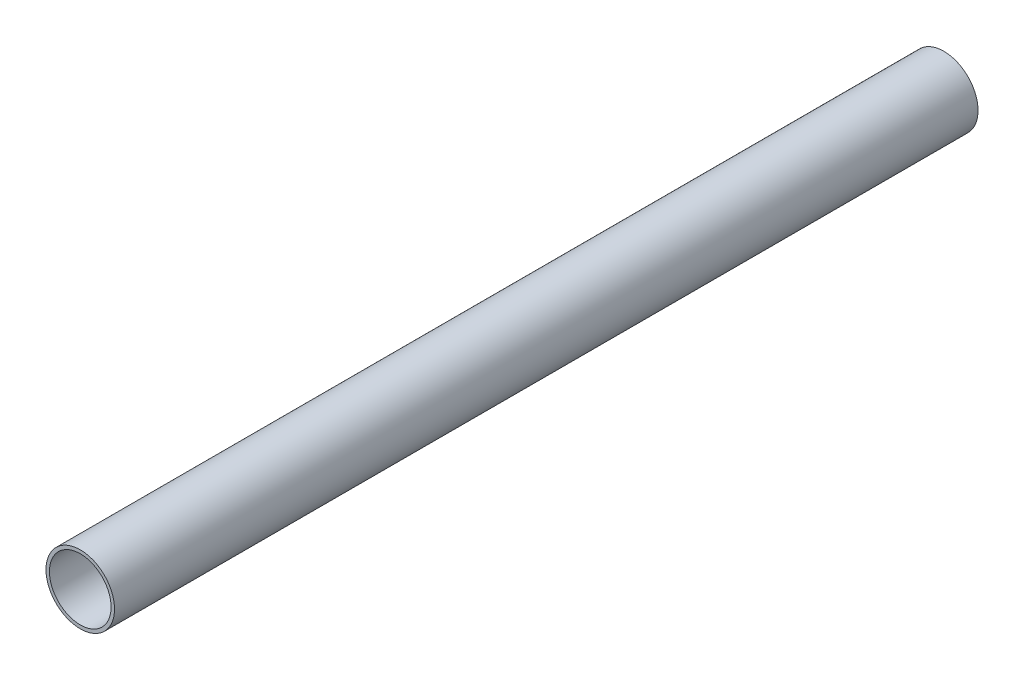
ISO-10303-21;
HEADER;
FILE_DESCRIPTION(('STEP AP214'),'2;1');
FILE_NAME('part.step','',(''),(''),'','','');
FILE_SCHEMA(('AUTOMOTIVE_DESIGN { 1 0 10303 214 1 1 1 1 }'));
ENDSEC;
DATA;
#1=APPLICATION_CONTEXT('core data for automotive mechanical design processes');
#2=APPLICATION_PROTOCOL_DEFINITION('international standard','automotive_design',2000,#1);
#3=PRODUCT_CONTEXT('',#1,'mechanical');
#4=PRODUCT('Part','Part','',(#3));
#5=PRODUCT_RELATED_PRODUCT_CATEGORY('part','',(#4));
#6=PRODUCT_DEFINITION_FORMATION('','',#4);
#7=PRODUCT_DEFINITION_CONTEXT('part definition',#1,'design');
#8=PRODUCT_DEFINITION('design','',#6,#7);
#9=PRODUCT_DEFINITION_SHAPE('','',#8);
#10=(LENGTH_UNIT() NAMED_UNIT(*) SI_UNIT(.MILLI.,.METRE.));
#11=(NAMED_UNIT(*) PLANE_ANGLE_UNIT() SI_UNIT($,.RADIAN.));
#12=(NAMED_UNIT(*) SI_UNIT($,.STERADIAN.) SOLID_ANGLE_UNIT());
#13=UNCERTAINTY_MEASURE_WITH_UNIT(LENGTH_MEASURE(1.E-05),#10,'distance_accuracy_value','');
#14=(GEOMETRIC_REPRESENTATION_CONTEXT(3) GLOBAL_UNCERTAINTY_ASSIGNED_CONTEXT((#13)) GLOBAL_UNIT_ASSIGNED_CONTEXT((#10,
#11,#12)) REPRESENTATION_CONTEXT('',''));
#15=CARTESIAN_POINT('',(0.,0.,0.));
#16=DIRECTION('',(0.,0.,1.));
#17=DIRECTION('',(1.,0.,0.));
#18=AXIS2_PLACEMENT_3D('',#15,#16,#17);
#19=CARTESIAN_POINT('',(373.869462597608,292.700388146608,200.025));
#20=DIRECTION('',(0.,0.,1.));
#21=DIRECTION('',(1.,0.,0.));
#22=AXIS2_PLACEMENT_3D('',#19,#20,#21);
#23=PLANE('',#22);
#24=CARTESIAN_POINT('',(373.869462597608,292.700388146608,200.025));
#25=DIRECTION('',(0.,0.,1.));
#26=DIRECTION('',(1.,0.,0.));
#27=AXIS2_PLACEMENT_3D('',#24,#25,#26);
#28=CIRCLE('',#27,15.875);
#29=CARTESIAN_POINT('',(357.994462597608,292.700388146608,200.025));
#30=VERTEX_POINT('',#29);
#31=EDGE_CURVE('E11',#30,#30,#28,.T.);
#32=ORIENTED_EDGE('',*,*,#31,.T.);
#33=EDGE_LOOP('',(#32));
#34=FACE_BOUND('',#33,.T.);
#35=CARTESIAN_POINT('',(373.869462597608,292.700388146608,200.025));
#36=DIRECTION('',(0.,0.,1.));
#37=DIRECTION('',(1.,0.,0.));
#38=AXIS2_PLACEMENT_3D('',#35,#36,#37);
#39=CIRCLE('',#38,14.2875);
#40=CARTESIAN_POINT('',(359.581962597608,292.700388146608,200.025));
#41=VERTEX_POINT('',#40);
#42=EDGE_CURVE('E54',#41,#41,#39,.T.);
#43=ORIENTED_EDGE('',*,*,#42,.F.);
#44=EDGE_LOOP('',(#43));
#45=FACE_BOUND('',#44,.T.);
#46=ADVANCED_FACE('F43',(#34,#45),#23,.T.);
#47=CARTESIAN_POINT('',(373.869462597608,292.700388146608,-200.025));
#48=DIRECTION('',(0.,0.,1.));
#49=DIRECTION('',(1.,0.,0.));
#50=AXIS2_PLACEMENT_3D('',#47,#48,#49);
#51=PLANE('',#50);
#52=CARTESIAN_POINT('',(373.869462597608,292.700388146608,-200.025));
#53=DIRECTION('',(0.,0.,1.));
#54=DIRECTION('',(1.,0.,0.));
#55=AXIS2_PLACEMENT_3D('',#52,#53,#54);
#56=CIRCLE('',#55,15.875);
#57=CARTESIAN_POINT('',(357.994462597608,292.700388146608,-200.025));
#58=VERTEX_POINT('',#57);
#59=EDGE_CURVE('E47',#58,#58,#56,.T.);
#60=ORIENTED_EDGE('',*,*,#59,.F.);
#61=EDGE_LOOP('',(#60));
#62=FACE_BOUND('',#61,.T.);
#63=CARTESIAN_POINT('',(373.869462597608,292.700388146608,-200.025));
#64=DIRECTION('',(0.,0.,1.));
#65=DIRECTION('',(1.,0.,0.));
#66=AXIS2_PLACEMENT_3D('',#63,#64,#65);
#67=CIRCLE('',#66,14.2875);
#68=CARTESIAN_POINT('',(359.581962597608,292.700388146608,-200.025));
#69=VERTEX_POINT('',#68);
#70=EDGE_CURVE('E56',#69,#69,#67,.T.);
#71=ORIENTED_EDGE('',*,*,#70,.T.);
#72=EDGE_LOOP('',(#71));
#73=FACE_BOUND('',#72,.T.);
#74=ADVANCED_FACE('F66',(#62,#73),#51,.F.);
#75=CARTESIAN_POINT('',(373.869462597608,292.700388146608,200.025));
#76=DIRECTION('',(0.,0.,-1.));
#77=DIRECTION('',(-1.,0.,0.));
#78=AXIS2_PLACEMENT_3D('',#75,#76,#77);
#79=CYLINDRICAL_SURFACE('',#78,15.875);
#80=CARTESIAN_POINT('',(357.994462597608,292.700388146608,200.025));
#81=CARTESIAN_POINT('',(357.994462597608,292.700388146608,195.8578125));
#82=CARTESIAN_POINT('',(357.994462597608,292.700388146608,191.690625));
#83=CARTESIAN_POINT('',(357.994462597608,292.700388146608,183.35625));
#84=CARTESIAN_POINT('',(357.994462597608,292.700388146608,179.1890625));
#85=CARTESIAN_POINT('',(357.994462597608,292.700388146608,170.8546875));
#86=CARTESIAN_POINT('',(357.994462597608,292.700388146608,166.6875));
#87=CARTESIAN_POINT('',(357.994462597608,292.700388146608,158.353125));
#88=CARTESIAN_POINT('',(357.994462597608,292.700388146608,154.1859375));
#89=CARTESIAN_POINT('',(357.994462597608,292.700388146608,145.8515625));
#90=CARTESIAN_POINT('',(357.994462597608,292.700388146608,141.684375));
#91=CARTESIAN_POINT('',(357.994462597608,292.700388146608,133.35));
#92=CARTESIAN_POINT('',(357.994462597608,292.700388146608,129.1828125));
#93=CARTESIAN_POINT('',(357.994462597608,292.700388146608,120.8484375));
#94=CARTESIAN_POINT('',(357.994462597608,292.700388146608,116.68125));
#95=CARTESIAN_POINT('',(357.994462597608,292.700388146608,108.346875));
#96=CARTESIAN_POINT('',(357.994462597608,292.700388146608,104.1796875));
#97=CARTESIAN_POINT('',(357.994462597608,292.700388146608,95.8453125));
#98=CARTESIAN_POINT('',(357.994462597608,292.700388146608,91.678125));
#99=CARTESIAN_POINT('',(357.994462597608,292.700388146608,83.34375));
#100=CARTESIAN_POINT('',(357.994462597608,292.700388146608,79.1765625));
#101=CARTESIAN_POINT('',(357.994462597608,292.700388146608,70.8421875));
#102=CARTESIAN_POINT('',(357.994462597608,292.700388146608,66.675));
#103=CARTESIAN_POINT('',(357.994462597608,292.700388146608,58.340625));
#104=CARTESIAN_POINT('',(357.994462597608,292.700388146608,54.1734375));
#105=CARTESIAN_POINT('',(357.994462597608,292.700388146608,45.8390625));
#106=CARTESIAN_POINT('',(357.994462597608,292.700388146608,41.671875));
#107=CARTESIAN_POINT('',(357.994462597608,292.700388146608,33.3375));
#108=CARTESIAN_POINT('',(357.994462597608,292.700388146608,29.1703125));
#109=CARTESIAN_POINT('',(357.994462597608,292.700388146608,20.8359375));
#110=CARTESIAN_POINT('',(357.994462597608,292.700388146608,16.66875));
#111=CARTESIAN_POINT('',(357.994462597608,292.700388146608,8.334375));
#112=CARTESIAN_POINT('',(357.994462597608,292.700388146608,4.1671875));
#113=CARTESIAN_POINT('',(357.994462597608,292.700388146608,-4.1671875));
#114=CARTESIAN_POINT('',(357.994462597608,292.700388146608,-8.334375));
#115=CARTESIAN_POINT('',(357.994462597608,292.700388146608,-16.66875));
#116=CARTESIAN_POINT('',(357.994462597608,292.700388146608,-20.8359375));
#117=CARTESIAN_POINT('',(357.994462597608,292.700388146608,-29.1703125));
#118=CARTESIAN_POINT('',(357.994462597608,292.700388146608,-33.3375));
#119=CARTESIAN_POINT('',(357.994462597608,292.700388146608,-41.671875));
#120=CARTESIAN_POINT('',(357.994462597608,292.700388146608,-45.8390625));
#121=CARTESIAN_POINT('',(357.994462597608,292.700388146608,-54.1734375));
#122=CARTESIAN_POINT('',(357.994462597608,292.700388146608,-58.340625));
#123=CARTESIAN_POINT('',(357.994462597608,292.700388146608,-66.675));
#124=CARTESIAN_POINT('',(357.994462597608,292.700388146608,-70.8421875));
#125=CARTESIAN_POINT('',(357.994462597608,292.700388146608,-79.1765625));
#126=CARTESIAN_POINT('',(357.994462597608,292.700388146608,-83.34375));
#127=CARTESIAN_POINT('',(357.994462597608,292.700388146608,-91.678125));
#128=CARTESIAN_POINT('',(357.994462597608,292.700388146608,-95.8453125));
#129=CARTESIAN_POINT('',(357.994462597608,292.700388146608,-104.1796875));
#130=CARTESIAN_POINT('',(357.994462597608,292.700388146608,-108.346875));
#131=CARTESIAN_POINT('',(357.994462597608,292.700388146608,-116.68125));
#132=CARTESIAN_POINT('',(357.994462597608,292.700388146608,-120.8484375));
#133=CARTESIAN_POINT('',(357.994462597608,292.700388146608,-129.1828125));
#134=CARTESIAN_POINT('',(357.994462597608,292.700388146608,-133.35));
#135=CARTESIAN_POINT('',(357.994462597608,292.700388146608,-141.684375));
#136=CARTESIAN_POINT('',(357.994462597608,292.700388146608,-145.8515625));
#137=CARTESIAN_POINT('',(357.994462597608,292.700388146608,-154.1859375));
#138=CARTESIAN_POINT('',(357.994462597608,292.700388146608,-158.353125));
#139=CARTESIAN_POINT('',(357.994462597608,292.700388146608,-166.6875));
#140=CARTESIAN_POINT('',(357.994462597608,292.700388146608,-170.8546875));
#141=CARTESIAN_POINT('',(357.994462597608,292.700388146608,-179.1890625));
#142=CARTESIAN_POINT('',(357.994462597608,292.700388146608,-183.35625));
#143=CARTESIAN_POINT('',(357.994462597608,292.700388146608,-191.690625));
#144=CARTESIAN_POINT('',(357.994462597608,292.700388146608,-195.8578125));
#145=CARTESIAN_POINT('',(357.994462597608,292.700388146608,-200.025));
#146=B_SPLINE_CURVE_WITH_KNOTS('',3,(#80,#81,#82,#83,#84,#85,#86,#87,#88,#89,#90,#91,#92,#93,
#94,#95,#96,#97,#98,#99,#100,#101,#102,#103,#104,#105,#106,#107,#108,#109,#110,#111,#112,#113,
#114,#115,#116,#117,#118,#119,#120,#121,#122,#123,#124,#125,#126,#127,#128,#129,#130,#131,#132,
#133,#134,#135,#136,#137,#138,#139,#140,#141,#142,#143,#144,#145),.UNSPECIFIED.,.F.,.F.,(4,2,2,
2,2,2,2,2,2,2,2,2,2,2,2,2,2,2,2,2,2,2,2,2,2,2,2,2,2,2,2,2,4),(0.,12.5015625,25.003125,
37.5046875,50.00625,62.5078125,75.009375,87.5109375,100.0125,112.5140625,125.015625,137.5171875,
150.01875,162.5203125,175.021875,187.5234375,200.025,212.5265625,225.028125,237.5296875,
250.03125,262.5328125,275.034375,287.5359375,300.0375,312.5390625,325.040625,337.5421875,
350.04375,362.5453125,375.046875,387.5484375,400.05),.UNSPECIFIED.);
#147=EDGE_CURVE('BSEAM45',#30,#58,#146,.T.);
#148=ORIENTED_EDGE('',*,*,#31,.F.);
#149=ORIENTED_EDGE('',*,*,#59,.T.);
#150=ORIENTED_EDGE('',*,*,#147,.T.);
#151=ORIENTED_EDGE('',*,*,#147,.F.);
#152=EDGE_LOOP('',(#148,#150,#149,#151));
#153=FACE_BOUND('',#152,.T.);
#154=ADVANCED_FACE('F45',(#153),#79,.T.);
#155=CARTESIAN_POINT('',(373.869462597608,292.700388146608,200.025));
#156=DIRECTION('',(0.,0.,-1.));
#157=DIRECTION('',(-1.,0.,0.));
#158=AXIS2_PLACEMENT_3D('',#155,#156,#157);
#159=CYLINDRICAL_SURFACE('',#158,14.2875);
#160=CARTESIAN_POINT('',(359.581962597608,292.700388146608,200.025));
#161=CARTESIAN_POINT('',(359.581962597608,292.700388146608,195.8578125));
#162=CARTESIAN_POINT('',(359.581962597608,292.700388146608,191.690625));
#163=CARTESIAN_POINT('',(359.581962597608,292.700388146608,183.35625));
#164=CARTESIAN_POINT('',(359.581962597608,292.700388146608,179.1890625));
#165=CARTESIAN_POINT('',(359.581962597608,292.700388146608,170.8546875));
#166=CARTESIAN_POINT('',(359.581962597608,292.700388146608,166.6875));
#167=CARTESIAN_POINT('',(359.581962597608,292.700388146608,158.353125));
#168=CARTESIAN_POINT('',(359.581962597608,292.700388146608,154.1859375));
#169=CARTESIAN_POINT('',(359.581962597608,292.700388146608,145.8515625));
#170=CARTESIAN_POINT('',(359.581962597608,292.700388146608,141.684375));
#171=CARTESIAN_POINT('',(359.581962597608,292.700388146608,133.35));
#172=CARTESIAN_POINT('',(359.581962597608,292.700388146608,129.1828125));
#173=CARTESIAN_POINT('',(359.581962597608,292.700388146608,120.8484375));
#174=CARTESIAN_POINT('',(359.581962597608,292.700388146608,116.68125));
#175=CARTESIAN_POINT('',(359.581962597608,292.700388146608,108.346875));
#176=CARTESIAN_POINT('',(359.581962597608,292.700388146608,104.1796875));
#177=CARTESIAN_POINT('',(359.581962597608,292.700388146608,95.8453125));
#178=CARTESIAN_POINT('',(359.581962597608,292.700388146608,91.678125));
#179=CARTESIAN_POINT('',(359.581962597608,292.700388146608,83.34375));
#180=CARTESIAN_POINT('',(359.581962597608,292.700388146608,79.1765625));
#181=CARTESIAN_POINT('',(359.581962597608,292.700388146608,70.8421875));
#182=CARTESIAN_POINT('',(359.581962597608,292.700388146608,66.675));
#183=CARTESIAN_POINT('',(359.581962597608,292.700388146608,58.340625));
#184=CARTESIAN_POINT('',(359.581962597608,292.700388146608,54.1734375));
#185=CARTESIAN_POINT('',(359.581962597608,292.700388146608,45.8390625));
#186=CARTESIAN_POINT('',(359.581962597608,292.700388146608,41.671875));
#187=CARTESIAN_POINT('',(359.581962597608,292.700388146608,33.3375));
#188=CARTESIAN_POINT('',(359.581962597608,292.700388146608,29.1703125));
#189=CARTESIAN_POINT('',(359.581962597608,292.700388146608,20.8359375));
#190=CARTESIAN_POINT('',(359.581962597608,292.700388146608,16.66875));
#191=CARTESIAN_POINT('',(359.581962597608,292.700388146608,8.334375));
#192=CARTESIAN_POINT('',(359.581962597608,292.700388146608,4.1671875));
#193=CARTESIAN_POINT('',(359.581962597608,292.700388146608,-4.1671875));
#194=CARTESIAN_POINT('',(359.581962597608,292.700388146608,-8.334375));
#195=CARTESIAN_POINT('',(359.581962597608,292.700388146608,-16.66875));
#196=CARTESIAN_POINT('',(359.581962597608,292.700388146608,-20.8359375));
#197=CARTESIAN_POINT('',(359.581962597608,292.700388146608,-29.1703125));
#198=CARTESIAN_POINT('',(359.581962597608,292.700388146608,-33.3375));
#199=CARTESIAN_POINT('',(359.581962597608,292.700388146608,-41.671875));
#200=CARTESIAN_POINT('',(359.581962597608,292.700388146608,-45.8390625));
#201=CARTESIAN_POINT('',(359.581962597608,292.700388146608,-54.1734375));
#202=CARTESIAN_POINT('',(359.581962597608,292.700388146608,-58.340625));
#203=CARTESIAN_POINT('',(359.581962597608,292.700388146608,-66.675));
#204=CARTESIAN_POINT('',(359.581962597608,292.700388146608,-70.8421875));
#205=CARTESIAN_POINT('',(359.581962597608,292.700388146608,-79.1765625));
#206=CARTESIAN_POINT('',(359.581962597608,292.700388146608,-83.34375));
#207=CARTESIAN_POINT('',(359.581962597608,292.700388146608,-91.678125));
#208=CARTESIAN_POINT('',(359.581962597608,292.700388146608,-95.8453125));
#209=CARTESIAN_POINT('',(359.581962597608,292.700388146608,-104.1796875));
#210=CARTESIAN_POINT('',(359.581962597608,292.700388146608,-108.346875));
#211=CARTESIAN_POINT('',(359.581962597608,292.700388146608,-116.68125));
#212=CARTESIAN_POINT('',(359.581962597608,292.700388146608,-120.8484375));
#213=CARTESIAN_POINT('',(359.581962597608,292.700388146608,-129.1828125));
#214=CARTESIAN_POINT('',(359.581962597608,292.700388146608,-133.35));
#215=CARTESIAN_POINT('',(359.581962597608,292.700388146608,-141.684375));
#216=CARTESIAN_POINT('',(359.581962597608,292.700388146608,-145.8515625));
#217=CARTESIAN_POINT('',(359.581962597608,292.700388146608,-154.1859375));
#218=CARTESIAN_POINT('',(359.581962597608,292.700388146608,-158.353125));
#219=CARTESIAN_POINT('',(359.581962597608,292.700388146608,-166.6875));
#220=CARTESIAN_POINT('',(359.581962597608,292.700388146608,-170.8546875));
#221=CARTESIAN_POINT('',(359.581962597608,292.700388146608,-179.1890625));
#222=CARTESIAN_POINT('',(359.581962597608,292.700388146608,-183.35625));
#223=CARTESIAN_POINT('',(359.581962597608,292.700388146608,-191.690625));
#224=CARTESIAN_POINT('',(359.581962597608,292.700388146608,-195.8578125));
#225=CARTESIAN_POINT('',(359.581962597608,292.700388146608,-200.025));
#226=B_SPLINE_CURVE_WITH_KNOTS('',3,(#160,#161,#162,#163,#164,#165,#166,#167,#168,#169,#170,
#171,#172,#173,#174,#175,#176,#177,#178,#179,#180,#181,#182,#183,#184,#185,#186,#187,#188,#189,
#190,#191,#192,#193,#194,#195,#196,#197,#198,#199,#200,#201,#202,#203,#204,#205,#206,#207,#208,
#209,#210,#211,#212,#213,#214,#215,#216,#217,#218,#219,#220,#221,#222,#223,#224,#225),
.UNSPECIFIED.,.F.,.F.,(4,2,2,2,2,2,2,2,2,2,2,2,2,2,2,2,2,2,2,2,2,2,2,2,2,2,2,2,2,2,2,2,4),(0.,
12.5015625,25.003125,37.5046875,50.00625,62.5078125,75.009375,87.5109375,100.0125,112.5140625,
125.015625,137.5171875,150.01875,162.5203125,175.021875,187.5234375,200.025,212.5265625,
225.028125,237.5296875,250.03125,262.5328125,275.034375,287.5359375,300.0375,312.5390625,
325.040625,337.5421875,350.04375,362.5453125,375.046875,387.5484375,400.05),.UNSPECIFIED.);
#227=EDGE_CURVE('BSEAM62',#41,#69,#226,.T.);
#228=ORIENTED_EDGE('',*,*,#42,.T.);
#229=ORIENTED_EDGE('',*,*,#70,.F.);
#230=ORIENTED_EDGE('',*,*,#227,.T.);
#231=ORIENTED_EDGE('',*,*,#227,.F.);
#232=EDGE_LOOP('',(#228,#230,#229,#231));
#233=FACE_BOUND('',#232,.T.);
#234=ADVANCED_FACE('F62',(#233),#159,.F.);
#235=CLOSED_SHELL('',(#46,#74,#154,#234));
#236=MANIFOLD_SOLID_BREP('B2',#235);
#237=ADVANCED_BREP_SHAPE_REPRESENTATION('',(#18,#236),#14);
#238=SHAPE_DEFINITION_REPRESENTATION(#9,#237);
ENDSEC;
END-ISO-10303-21;
